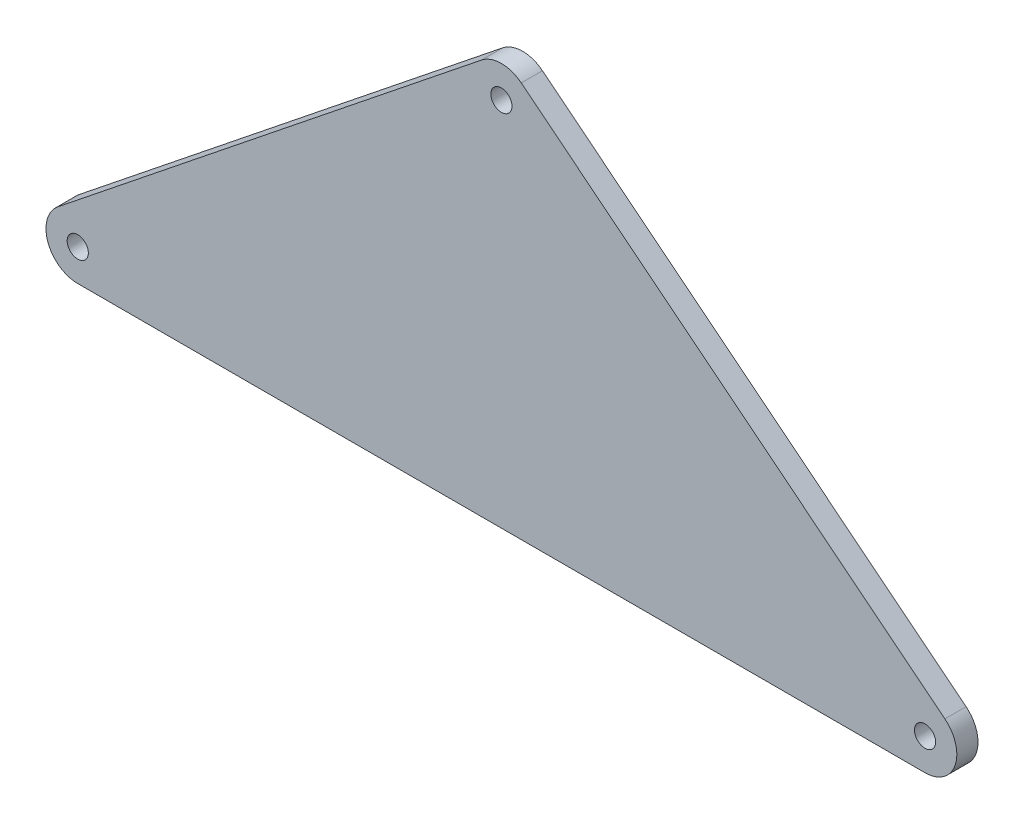
ISO-10303-21;
HEADER;
FILE_DESCRIPTION(('STEP AP214'),'2;1');
FILE_NAME('part.step','',(''),(''),'','','');
FILE_SCHEMA(('AUTOMOTIVE_DESIGN { 1 0 10303 214 1 1 1 1 }'));
ENDSEC;
DATA;
#1=APPLICATION_CONTEXT('core data for automotive mechanical design processes');
#2=APPLICATION_PROTOCOL_DEFINITION('international standard','automotive_design',2000,#1);
#3=PRODUCT_CONTEXT('',#1,'mechanical');
#4=PRODUCT('Part','Part','',(#3));
#5=PRODUCT_RELATED_PRODUCT_CATEGORY('part','',(#4));
#6=PRODUCT_DEFINITION_FORMATION('','',#4);
#7=PRODUCT_DEFINITION_CONTEXT('part definition',#1,'design');
#8=PRODUCT_DEFINITION('design','',#6,#7);
#9=PRODUCT_DEFINITION_SHAPE('','',#8);
#10=(LENGTH_UNIT() NAMED_UNIT(*) SI_UNIT(.MILLI.,.METRE.));
#11=(NAMED_UNIT(*) PLANE_ANGLE_UNIT() SI_UNIT($,.RADIAN.));
#12=(NAMED_UNIT(*) SI_UNIT($,.STERADIAN.) SOLID_ANGLE_UNIT());
#13=UNCERTAINTY_MEASURE_WITH_UNIT(LENGTH_MEASURE(1.E-05),#10,'distance_accuracy_value','');
#14=(GEOMETRIC_REPRESENTATION_CONTEXT(3) GLOBAL_UNCERTAINTY_ASSIGNED_CONTEXT((#13)) GLOBAL_UNIT_ASSIGNED_CONTEXT((#10,
#11,#12)) REPRESENTATION_CONTEXT('',''));
#15=CARTESIAN_POINT('',(0.,0.,0.));
#16=DIRECTION('',(0.,0.,1.));
#17=DIRECTION('',(1.,0.,0.));
#18=AXIS2_PLACEMENT_3D('',#15,#16,#17);
#19=CARTESIAN_POINT('',(-7.21644966006352E-13,-4.76249999999923,3.175));
#20=DIRECTION('',(0.,1.00000000000001,0.));
#21=DIRECTION('',(-1.00000000000001,0.,0.));
#22=AXIS2_PLACEMENT_3D('',#19,#20,#21);
#23=PLANE('',#22);
#24=DIRECTION('',(1.00000000000001,0.,0.));
#25=VECTOR('',#24,1.);
#26=CARTESIAN_POINT('',(-7.21644966006352E-13,-4.76249999999923,0.));
#27=LINE('',#26,#25);
#28=CARTESIAN_POINT('',(-7.21644966006352E-13,-4.76249999999923,0.));
#29=VERTEX_POINT('',#28);
#30=CARTESIAN_POINT('',(127.,-4.76249999999917,0.));
#31=VERTEX_POINT('',#30);
#32=EDGE_CURVE('E129',#29,#31,#27,.T.);
#33=ORIENTED_EDGE('',*,*,#32,.T.);
#34=DIRECTION('',(0.,0.,-0.999999999999993));
#35=VECTOR('',#34,1.);
#36=CARTESIAN_POINT('',(127.,-4.76249999999917,3.175));
#37=LINE('',#36,#35);
#38=CARTESIAN_POINT('',(127.,-4.76249999999917,3.175));
#39=VERTEX_POINT('',#38);
#40=EDGE_CURVE('E11',#39,#31,#37,.T.);
#41=ORIENTED_EDGE('',*,*,#40,.F.);
#42=DIRECTION('',(1.00000000000001,0.,0.));
#43=VECTOR('',#42,1.);
#44=CARTESIAN_POINT('',(-7.21644966006352E-13,-4.76249999999923,3.175));
#45=LINE('',#44,#43);
#46=CARTESIAN_POINT('',(-7.21644966006352E-13,-4.76249999999923,3.175));
#47=VERTEX_POINT('',#46);
#48=EDGE_CURVE('E150',#47,#39,#45,.T.);
#49=ORIENTED_EDGE('',*,*,#48,.F.);
#50=DIRECTION('',(0.,0.,-0.999999999999993));
#51=VECTOR('',#50,1.);
#52=CARTESIAN_POINT('',(-7.21644966006352E-13,-4.76249999999923,3.175));
#53=LINE('',#52,#51);
#54=EDGE_CURVE('E128',#47,#29,#53,.T.);
#55=ORIENTED_EDGE('',*,*,#54,.T.);
#56=EDGE_LOOP('',(#33,#41,#49,#55));
#57=FACE_BOUND('',#56,.T.);
#58=ADVANCED_FACE('F36',(#57),#23,.F.);
#59=CARTESIAN_POINT('',(127.,9.15933995315754E-13,3.175));
#60=DIRECTION('',(0.,0.,-0.999999999999993));
#61=DIRECTION('',(-1.00000000000001,0.,0.));
#62=AXIS2_PLACEMENT_3D('',#59,#60,#61);
#63=CYLINDRICAL_SURFACE('',#62,4.76250000000001);
#64=CARTESIAN_POINT('',(127.,9.15933995315754E-13,0.));
#65=DIRECTION('',(0.,0.,0.999999999999993));
#66=DIRECTION('',(1.00000000000001,0.,0.));
#67=AXIS2_PLACEMENT_3D('',#64,#65,#66);
#68=CIRCLE('',#67,4.76250000000001);
#69=CARTESIAN_POINT('',(129.975110163979,3.71888770497322,0.));
#70=VERTEX_POINT('',#69);
#71=EDGE_CURVE('E132',#31,#70,#68,.T.);
#72=ORIENTED_EDGE('',*,*,#71,.T.);
#73=DIRECTION('',(0.,0.,-0.999999999999993));
#74=VECTOR('',#73,1.);
#75=CARTESIAN_POINT('',(129.975110163979,3.71888770497322,3.175));
#76=LINE('',#75,#74);
#77=CARTESIAN_POINT('',(129.975110163979,3.71888770497322,3.175));
#78=VERTEX_POINT('',#77);
#79=EDGE_CURVE('E44',#78,#70,#76,.T.);
#80=ORIENTED_EDGE('',*,*,#79,.F.);
#81=CARTESIAN_POINT('',(127.,9.15933995315754E-13,3.175));
#82=DIRECTION('',(0.,0.,0.999999999999993));
#83=DIRECTION('',(1.00000000000001,0.,0.));
#84=AXIS2_PLACEMENT_3D('',#81,#82,#83);
#85=CIRCLE('',#84,4.76250000000001);
#86=EDGE_CURVE('E89',#39,#78,#85,.T.);
#87=ORIENTED_EDGE('',*,*,#86,.F.);
#88=ORIENTED_EDGE('',*,*,#40,.T.);
#89=EDGE_LOOP('',(#72,#80,#87,#88));
#90=FACE_BOUND('',#89,.T.);
#91=ADVANCED_FACE('F156',(#90),#63,.T.);
#92=CARTESIAN_POINT('',(52.5360857737335,65.6701072171687,3.175));
#93=DIRECTION('',(0.624695047554427,0.780868809443034,0.));
#94=DIRECTION('',(-0.780868809443035,0.624695047554427,0.));
#95=AXIS2_PLACEMENT_3D('',#92,#93,#94);
#96=PLANE('',#95);
#97=DIRECTION('',(0.780868809443035,-0.624695047554427,0.));
#98=VECTOR('',#97,1.);
#99=CARTESIAN_POINT('',(52.5360857737335,65.6701072171687,0.));
#100=LINE('',#99,#98);
#101=CARTESIAN_POINT('',(66.4751101639774,54.5188877049733,0.));
#102=VERTEX_POINT('',#101);
#103=EDGE_CURVE('E135',#102,#70,#100,.T.);
#104=ORIENTED_EDGE('',*,*,#103,.F.);
#105=DIRECTION('',(0.,0.,-0.999999999999993));
#106=VECTOR('',#105,1.);
#107=CARTESIAN_POINT('',(66.4751101639774,54.5188877049733,3.175));
#108=LINE('',#107,#106);
#109=CARTESIAN_POINT('',(66.4751101639774,54.5188877049733,3.175));
#110=VERTEX_POINT('',#109);
#111=EDGE_CURVE('E111',#110,#102,#108,.T.);
#112=ORIENTED_EDGE('',*,*,#111,.F.);
#113=DIRECTION('',(0.780868809443035,-0.624695047554427,0.));
#114=VECTOR('',#113,1.);
#115=CARTESIAN_POINT('',(52.5360857737335,65.6701072171687,3.175));
#116=LINE('',#115,#114);
#117=EDGE_CURVE('E104',#110,#78,#116,.T.);
#118=ORIENTED_EDGE('',*,*,#117,.T.);
#119=ORIENTED_EDGE('',*,*,#79,.T.);
#120=EDGE_LOOP('',(#104,#112,#118,#119));
#121=FACE_BOUND('',#120,.T.);
#122=ADVANCED_FACE('F155',(#121),#96,.T.);
#123=CARTESIAN_POINT('',(63.4999999999999,50.8000000000009,3.175));
#124=DIRECTION('',(0.,0.,-0.999999999999993));
#125=DIRECTION('',(-1.00000000000001,0.,0.));
#126=AXIS2_PLACEMENT_3D('',#123,#124,#125);
#127=CYLINDRICAL_SURFACE('',#126,4.7625);
#128=CARTESIAN_POINT('',(63.4999999999999,50.8000000000009,0.));
#129=DIRECTION('',(0.,0.,0.999999999999993));
#130=DIRECTION('',(1.00000000000001,0.,0.));
#131=AXIS2_PLACEMENT_3D('',#128,#129,#130);
#132=CIRCLE('',#131,4.7625);
#133=CARTESIAN_POINT('',(60.524889836022,54.5188877049733,0.));
#134=VERTEX_POINT('',#133);
#135=EDGE_CURVE('E110',#102,#134,#132,.T.);
#136=ORIENTED_EDGE('',*,*,#135,.T.);
#137=DIRECTION('',(0.,0.,-0.999999999999993));
#138=VECTOR('',#137,1.);
#139=CARTESIAN_POINT('',(60.524889836022,54.5188877049733,3.175));
#140=LINE('',#139,#138);
#141=CARTESIAN_POINT('',(60.524889836022,54.5188877049733,3.175));
#142=VERTEX_POINT('',#141);
#143=EDGE_CURVE('E107',#142,#134,#140,.T.);
#144=ORIENTED_EDGE('',*,*,#143,.F.);
#145=CARTESIAN_POINT('',(63.4999999999999,50.8000000000009,3.175));
#146=DIRECTION('',(0.,0.,0.999999999999993));
#147=DIRECTION('',(1.00000000000001,0.,0.));
#148=AXIS2_PLACEMENT_3D('',#145,#146,#147);
#149=CIRCLE('',#148,4.7625);
#150=EDGE_CURVE('E97',#110,#142,#149,.T.);
#151=ORIENTED_EDGE('',*,*,#150,.F.);
#152=ORIENTED_EDGE('',*,*,#111,.T.);
#153=EDGE_LOOP('',(#136,#144,#151,#152));
#154=FACE_BOUND('',#153,.T.);
#155=ADVANCED_FACE('F108',(#154),#127,.T.);
#156=CARTESIAN_POINT('',(-2.97511016397858,3.71888770497356,3.175));
#157=DIRECTION('',(0.624695047554428,-0.780868809443035,0.));
#158=DIRECTION('',(0.780868809443035,0.624695047554428,0.));
#159=AXIS2_PLACEMENT_3D('',#156,#157,#158);
#160=PLANE('',#159);
#161=DIRECTION('',(-0.780868809443035,-0.624695047554428,0.));
#162=VECTOR('',#161,1.);
#163=CARTESIAN_POINT('',(-2.97511016397858,3.71888770497356,0.));
#164=LINE('',#163,#162);
#165=CARTESIAN_POINT('',(-2.97511016397861,3.71888770497358,0.));
#166=VERTEX_POINT('',#165);
#167=EDGE_CURVE('E75',#134,#166,#164,.T.);
#168=ORIENTED_EDGE('',*,*,#167,.T.);
#169=DIRECTION('',(0.,0.,-0.999999999999993));
#170=VECTOR('',#169,1.);
#171=CARTESIAN_POINT('',(-2.97511016397861,3.71888770497358,3.175));
#172=LINE('',#171,#170);
#173=CARTESIAN_POINT('',(-2.97511016397861,3.71888770497358,3.175));
#174=VERTEX_POINT('',#173);
#175=EDGE_CURVE('E112',#174,#166,#172,.T.);
#176=ORIENTED_EDGE('',*,*,#175,.F.);
#177=DIRECTION('',(-0.780868809443035,-0.624695047554428,0.));
#178=VECTOR('',#177,1.);
#179=CARTESIAN_POINT('',(-2.97511016397858,3.71888770497356,3.175));
#180=LINE('',#179,#178);
#181=EDGE_CURVE('E102',#142,#174,#180,.T.);
#182=ORIENTED_EDGE('',*,*,#181,.F.);
#183=ORIENTED_EDGE('',*,*,#143,.T.);
#184=EDGE_LOOP('',(#168,#176,#182,#183));
#185=FACE_BOUND('',#184,.T.);
#186=ADVANCED_FACE('F114',(#185),#160,.F.);
#187=CARTESIAN_POINT('',(63.4999999999999,50.8000000000009,3.175));
#188=DIRECTION('',(0.,0.,-0.999999999999993));
#189=DIRECTION('',(-1.00000000000001,0.,0.));
#190=AXIS2_PLACEMENT_3D('',#187,#188,#189);
#191=CYLINDRICAL_SURFACE('',#190,1.5875);
#192=CARTESIAN_POINT('',(63.4999999999999,50.8000000000009,3.175));
#193=DIRECTION('',(0.,0.,0.999999999999993));
#194=DIRECTION('',(1.00000000000001,0.,0.));
#195=AXIS2_PLACEMENT_3D('',#192,#193,#194);
#196=CIRCLE('',#195,1.5875);
#197=CARTESIAN_POINT('',(61.9124999999999,50.8000000000009,3.175));
#198=VERTEX_POINT('',#197);
#199=EDGE_CURVE('E122',#198,#198,#196,.T.);
#200=CARTESIAN_POINT('',(63.4999999999999,50.8000000000009,0.));
#201=DIRECTION('',(0.,0.,0.999999999999993));
#202=DIRECTION('',(1.00000000000001,0.,0.));
#203=AXIS2_PLACEMENT_3D('',#200,#201,#202);
#204=CIRCLE('',#203,1.5875);
#205=CARTESIAN_POINT('',(61.9124999999999,50.8000000000009,0.));
#206=VERTEX_POINT('',#205);
#207=EDGE_CURVE('E144',#206,#206,#204,.T.);
#208=CARTESIAN_POINT('',(61.9124999999999,50.8000000000009,3.175));
#209=CARTESIAN_POINT('',(61.9124999999999,50.8000000000009,3.14192708333333));
#210=CARTESIAN_POINT('',(61.9124999999999,50.8000000000009,3.10885416666666));
#211=CARTESIAN_POINT('',(61.9124999999999,50.8000000000009,3.04270833333333));
#212=CARTESIAN_POINT('',(61.9124999999999,50.8000000000009,3.00963541666666));
#213=CARTESIAN_POINT('',(61.9124999999999,50.8000000000009,2.94348958333333));
#214=CARTESIAN_POINT('',(61.9124999999999,50.8000000000009,2.91041666666666));
#215=CARTESIAN_POINT('',(61.9124999999999,50.8000000000009,2.84427083333333));
#216=CARTESIAN_POINT('',(61.9124999999999,50.8000000000009,2.81119791666666));
#217=CARTESIAN_POINT('',(61.9124999999999,50.8000000000009,2.74505208333333));
#218=CARTESIAN_POINT('',(61.9124999999999,50.8000000000009,2.71197916666666));
#219=CARTESIAN_POINT('',(61.9124999999999,50.8000000000009,2.64583333333333));
#220=CARTESIAN_POINT('',(61.9124999999999,50.8000000000009,2.61276041666666));
#221=CARTESIAN_POINT('',(61.9124999999999,50.8000000000009,2.54661458333333));
#222=CARTESIAN_POINT('',(61.9124999999999,50.8000000000009,2.51354166666667));
#223=CARTESIAN_POINT('',(61.9124999999999,50.8000000000009,2.44739583333333));
#224=CARTESIAN_POINT('',(61.9124999999999,50.8000000000009,2.41432291666667));
#225=CARTESIAN_POINT('',(61.9124999999999,50.8000000000009,2.34817708333333));
#226=CARTESIAN_POINT('',(61.9124999999999,50.8000000000009,2.31510416666666));
#227=CARTESIAN_POINT('',(61.9124999999999,50.8000000000009,2.24895833333333));
#228=CARTESIAN_POINT('',(61.9124999999999,50.8000000000009,2.21588541666666));
#229=CARTESIAN_POINT('',(61.9124999999999,50.8000000000009,2.14973958333333));
#230=CARTESIAN_POINT('',(61.9124999999999,50.8000000000009,2.11666666666666));
#231=CARTESIAN_POINT('',(61.9124999999999,50.8000000000009,2.05052083333333));
#232=CARTESIAN_POINT('',(61.9124999999999,50.8000000000009,2.01744791666667));
#233=CARTESIAN_POINT('',(61.9124999999999,50.8000000000009,1.95130208333333));
#234=CARTESIAN_POINT('',(61.9124999999999,50.8000000000009,1.91822916666667));
#235=CARTESIAN_POINT('',(61.9124999999999,50.8000000000009,1.85208333333333));
#236=CARTESIAN_POINT('',(61.9124999999999,50.8000000000009,1.81901041666667));
#237=CARTESIAN_POINT('',(61.9124999999999,50.8000000000009,1.75286458333333));
#238=CARTESIAN_POINT('',(61.9124999999999,50.8000000000009,1.71979166666667));
#239=CARTESIAN_POINT('',(61.9124999999999,50.8000000000009,1.65364583333333));
#240=CARTESIAN_POINT('',(61.9124999999999,50.8000000000009,1.62057291666667));
#241=CARTESIAN_POINT('',(61.9124999999999,50.8000000000009,1.55442708333333));
#242=CARTESIAN_POINT('',(61.9124999999999,50.8000000000009,1.52135416666667));
#243=CARTESIAN_POINT('',(61.9124999999999,50.8000000000009,1.45520833333333));
#244=CARTESIAN_POINT('',(61.9124999999999,50.8000000000009,1.42213541666667));
#245=CARTESIAN_POINT('',(61.9124999999999,50.8000000000009,1.35598958333333));
#246=CARTESIAN_POINT('',(61.9124999999999,50.8000000000009,1.32291666666667));
#247=CARTESIAN_POINT('',(61.9124999999999,50.8000000000009,1.25677083333333));
#248=CARTESIAN_POINT('',(61.9124999999999,50.8000000000009,1.22369791666667));
#249=CARTESIAN_POINT('',(61.9124999999999,50.8000000000009,1.15755208333333));
#250=CARTESIAN_POINT('',(61.9124999999999,50.8000000000009,1.12447916666667));
#251=CARTESIAN_POINT('',(61.9124999999999,50.8000000000009,1.05833333333333));
#252=CARTESIAN_POINT('',(61.9124999999999,50.8000000000009,1.02526041666667));
#253=CARTESIAN_POINT('',(61.9124999999999,50.8000000000009,0.959114583333333));
#254=CARTESIAN_POINT('',(61.9124999999999,50.8000000000009,0.926041666666666));
#255=CARTESIAN_POINT('',(61.9124999999999,50.8000000000009,0.859895833333333));
#256=CARTESIAN_POINT('',(61.9124999999999,50.8000000000009,0.826822916666666));
#257=CARTESIAN_POINT('',(61.9124999999999,50.8000000000009,0.760677083333333));
#258=CARTESIAN_POINT('',(61.9124999999999,50.8000000000009,0.727604166666666));
#259=CARTESIAN_POINT('',(61.9124999999999,50.8000000000009,0.661458333333333));
#260=CARTESIAN_POINT('',(61.9124999999999,50.8000000000009,0.628385416666666));
#261=CARTESIAN_POINT('',(61.9124999999999,50.8000000000009,0.562239583333333));
#262=CARTESIAN_POINT('',(61.9124999999999,50.8000000000009,0.529166666666666));
#263=CARTESIAN_POINT('',(61.9124999999999,50.8000000000009,0.463020833333333));
#264=CARTESIAN_POINT('',(61.9124999999999,50.8000000000009,0.429947916666666));
#265=CARTESIAN_POINT('',(61.9124999999999,50.8000000000009,0.363802083333333));
#266=CARTESIAN_POINT('',(61.9124999999999,50.8000000000009,0.330729166666666));
#267=CARTESIAN_POINT('',(61.9124999999999,50.8000000000009,0.264583333333333));
#268=CARTESIAN_POINT('',(61.9124999999999,50.8000000000009,0.231510416666666));
#269=CARTESIAN_POINT('',(61.9124999999999,50.8000000000009,0.165364583333333));
#270=CARTESIAN_POINT('',(61.9124999999999,50.8000000000009,0.132291666666666));
#271=CARTESIAN_POINT('',(61.9124999999999,50.8000000000009,0.0661458333333333));
#272=CARTESIAN_POINT('',(61.9124999999999,50.8000000000009,0.0330729166666666));
#273=CARTESIAN_POINT('',(61.9124999999999,50.8000000000009,0.));
#274=B_SPLINE_CURVE_WITH_KNOTS('',3,(#208,#209,#210,#211,#212,#213,#214,#215,#216,#217,#218,
#219,#220,#221,#222,#223,#224,#225,#226,#227,#228,#229,#230,#231,#232,#233,#234,#235,#236,#237,
#238,#239,#240,#241,#242,#243,#244,#245,#246,#247,#248,#249,#250,#251,#252,#253,#254,#255,#256,
#257,#258,#259,#260,#261,#262,#263,#264,#265,#266,#267,#268,#269,#270,#271,#272,#273),
.UNSPECIFIED.,.F.,.F.,(4,2,2,2,2,2,2,2,2,2,2,2,2,2,2,2,2,2,2,2,2,2,2,2,2,2,2,2,2,2,2,2,4),(0.,
0.0992187499999995,0.1984375,0.297656249999999,0.396875,0.496093749999999,0.595312499999999,
0.694531249999999,0.793749999999999,0.892968749999999,0.992187499999999,1.09140625,1.190625,
1.28984375,1.3890625,1.48828125,1.5875,1.68671875,1.7859375,1.88515625,1.984375,2.08359375,
2.1828125,2.28203125,2.38125,2.48046875,2.5796875,2.67890625,2.778125,2.87734375,2.9765625,
3.07578125,3.175),.UNSPECIFIED.);
#275=EDGE_CURVE('BSEAM175',#198,#206,#274,.T.);
#276=ORIENTED_EDGE('',*,*,#199,.T.);
#277=ORIENTED_EDGE('',*,*,#207,.F.);
#278=ORIENTED_EDGE('',*,*,#275,.T.);
#279=ORIENTED_EDGE('',*,*,#275,.F.);
#280=EDGE_LOOP('',(#276,#278,#277,#279));
#281=FACE_BOUND('',#280,.T.);
#282=ADVANCED_FACE('F175',(#281),#191,.F.);
#283=CARTESIAN_POINT('',(0.,0.,3.175));
#284=DIRECTION('',(0.,0.,-0.999999999999993));
#285=DIRECTION('',(-1.00000000000001,0.,0.));
#286=AXIS2_PLACEMENT_3D('',#283,#284,#285);
#287=CYLINDRICAL_SURFACE('',#286,1.5875);
#288=CARTESIAN_POINT('',(0.,0.,3.175));
#289=DIRECTION('',(0.,0.,0.999999999999993));
#290=DIRECTION('',(1.00000000000001,0.,0.));
#291=AXIS2_PLACEMENT_3D('',#288,#289,#290);
#292=CIRCLE('',#291,1.5875);
#293=CARTESIAN_POINT('',(-1.58750000000001,0.,3.175));
#294=VERTEX_POINT('',#293);
#295=EDGE_CURVE('E116',#294,#294,#292,.T.);
#296=CARTESIAN_POINT('',(0.,0.,0.));
#297=DIRECTION('',(0.,0.,0.999999999999993));
#298=DIRECTION('',(1.00000000000001,0.,0.));
#299=AXIS2_PLACEMENT_3D('',#296,#297,#298);
#300=CIRCLE('',#299,1.5875);
#301=CARTESIAN_POINT('',(-1.58750000000001,0.,0.));
#302=VERTEX_POINT('',#301);
#303=EDGE_CURVE('E141',#302,#302,#300,.T.);
#304=CARTESIAN_POINT('',(-1.58750000000001,0.,3.175));
#305=CARTESIAN_POINT('',(-1.58750000000001,0.,3.14192708333333));
#306=CARTESIAN_POINT('',(-1.58750000000001,0.,3.10885416666666));
#307=CARTESIAN_POINT('',(-1.58750000000001,0.,3.04270833333333));
#308=CARTESIAN_POINT('',(-1.58750000000001,0.,3.00963541666666));
#309=CARTESIAN_POINT('',(-1.58750000000001,0.,2.94348958333333));
#310=CARTESIAN_POINT('',(-1.58750000000001,0.,2.91041666666666));
#311=CARTESIAN_POINT('',(-1.58750000000001,0.,2.84427083333333));
#312=CARTESIAN_POINT('',(-1.58750000000001,0.,2.81119791666666));
#313=CARTESIAN_POINT('',(-1.58750000000001,0.,2.74505208333333));
#314=CARTESIAN_POINT('',(-1.58750000000001,0.,2.71197916666666));
#315=CARTESIAN_POINT('',(-1.58750000000001,0.,2.64583333333333));
#316=CARTESIAN_POINT('',(-1.58750000000001,0.,2.61276041666666));
#317=CARTESIAN_POINT('',(-1.58750000000001,0.,2.54661458333333));
#318=CARTESIAN_POINT('',(-1.58750000000001,0.,2.51354166666667));
#319=CARTESIAN_POINT('',(-1.58750000000001,0.,2.44739583333333));
#320=CARTESIAN_POINT('',(-1.58750000000001,0.,2.41432291666667));
#321=CARTESIAN_POINT('',(-1.58750000000001,0.,2.34817708333333));
#322=CARTESIAN_POINT('',(-1.58750000000001,0.,2.31510416666666));
#323=CARTESIAN_POINT('',(-1.58750000000001,0.,2.24895833333333));
#324=CARTESIAN_POINT('',(-1.58750000000001,0.,2.21588541666666));
#325=CARTESIAN_POINT('',(-1.58750000000001,0.,2.14973958333333));
#326=CARTESIAN_POINT('',(-1.58750000000001,0.,2.11666666666666));
#327=CARTESIAN_POINT('',(-1.58750000000001,0.,2.05052083333333));
#328=CARTESIAN_POINT('',(-1.58750000000001,0.,2.01744791666667));
#329=CARTESIAN_POINT('',(-1.58750000000001,0.,1.95130208333333));
#330=CARTESIAN_POINT('',(-1.58750000000001,0.,1.91822916666667));
#331=CARTESIAN_POINT('',(-1.58750000000001,0.,1.85208333333333));
#332=CARTESIAN_POINT('',(-1.58750000000001,0.,1.81901041666667));
#333=CARTESIAN_POINT('',(-1.58750000000001,0.,1.75286458333333));
#334=CARTESIAN_POINT('',(-1.58750000000001,0.,1.71979166666667));
#335=CARTESIAN_POINT('',(-1.58750000000001,0.,1.65364583333333));
#336=CARTESIAN_POINT('',(-1.58750000000001,0.,1.62057291666667));
#337=CARTESIAN_POINT('',(-1.58750000000001,0.,1.55442708333333));
#338=CARTESIAN_POINT('',(-1.58750000000001,0.,1.52135416666667));
#339=CARTESIAN_POINT('',(-1.58750000000001,0.,1.45520833333333));
#340=CARTESIAN_POINT('',(-1.58750000000001,0.,1.42213541666667));
#341=CARTESIAN_POINT('',(-1.58750000000001,0.,1.35598958333333));
#342=CARTESIAN_POINT('',(-1.58750000000001,0.,1.32291666666667));
#343=CARTESIAN_POINT('',(-1.58750000000001,0.,1.25677083333333));
#344=CARTESIAN_POINT('',(-1.58750000000001,0.,1.22369791666667));
#345=CARTESIAN_POINT('',(-1.58750000000001,0.,1.15755208333333));
#346=CARTESIAN_POINT('',(-1.58750000000001,0.,1.12447916666667));
#347=CARTESIAN_POINT('',(-1.58750000000001,0.,1.05833333333333));
#348=CARTESIAN_POINT('',(-1.58750000000001,0.,1.02526041666667));
#349=CARTESIAN_POINT('',(-1.58750000000001,0.,0.959114583333333));
#350=CARTESIAN_POINT('',(-1.58750000000001,0.,0.926041666666666));
#351=CARTESIAN_POINT('',(-1.58750000000001,0.,0.859895833333333));
#352=CARTESIAN_POINT('',(-1.58750000000001,0.,0.826822916666666));
#353=CARTESIAN_POINT('',(-1.58750000000001,0.,0.760677083333333));
#354=CARTESIAN_POINT('',(-1.58750000000001,0.,0.727604166666666));
#355=CARTESIAN_POINT('',(-1.58750000000001,0.,0.661458333333333));
#356=CARTESIAN_POINT('',(-1.58750000000001,0.,0.628385416666666));
#357=CARTESIAN_POINT('',(-1.58750000000001,0.,0.562239583333333));
#358=CARTESIAN_POINT('',(-1.58750000000001,0.,0.529166666666666));
#359=CARTESIAN_POINT('',(-1.58750000000001,0.,0.463020833333333));
#360=CARTESIAN_POINT('',(-1.58750000000001,0.,0.429947916666666));
#361=CARTESIAN_POINT('',(-1.58750000000001,0.,0.363802083333333));
#362=CARTESIAN_POINT('',(-1.58750000000001,0.,0.330729166666666));
#363=CARTESIAN_POINT('',(-1.58750000000001,0.,0.264583333333333));
#364=CARTESIAN_POINT('',(-1.58750000000001,0.,0.231510416666666));
#365=CARTESIAN_POINT('',(-1.58750000000001,0.,0.165364583333333));
#366=CARTESIAN_POINT('',(-1.58750000000001,0.,0.132291666666666));
#367=CARTESIAN_POINT('',(-1.58750000000001,0.,0.0661458333333333));
#368=CARTESIAN_POINT('',(-1.58750000000001,0.,0.0330729166666666));
#369=CARTESIAN_POINT('',(-1.58750000000001,0.,0.));
#370=B_SPLINE_CURVE_WITH_KNOTS('',3,(#304,#305,#306,#307,#308,#309,#310,#311,#312,#313,#314,
#315,#316,#317,#318,#319,#320,#321,#322,#323,#324,#325,#326,#327,#328,#329,#330,#331,#332,#333,
#334,#335,#336,#337,#338,#339,#340,#341,#342,#343,#344,#345,#346,#347,#348,#349,#350,#351,#352,
#353,#354,#355,#356,#357,#358,#359,#360,#361,#362,#363,#364,#365,#366,#367,#368,#369),
.UNSPECIFIED.,.F.,.F.,(4,2,2,2,2,2,2,2,2,2,2,2,2,2,2,2,2,2,2,2,2,2,2,2,2,2,2,2,2,2,2,2,4),(0.,
0.0992187499999995,0.1984375,0.297656249999999,0.396875,0.496093749999999,0.595312499999999,
0.694531249999999,0.793749999999999,0.892968749999999,0.992187499999999,1.09140625,1.190625,
1.28984375,1.3890625,1.48828125,1.5875,1.68671875,1.7859375,1.88515625,1.984375,2.08359375,
2.1828125,2.28203125,2.38125,2.48046875,2.5796875,2.67890625,2.778125,2.87734375,2.9765625,
3.07578125,3.175),.UNSPECIFIED.);
#371=EDGE_CURVE('BSEAM167',#294,#302,#370,.T.);
#372=ORIENTED_EDGE('',*,*,#295,.T.);
#373=ORIENTED_EDGE('',*,*,#303,.F.);
#374=ORIENTED_EDGE('',*,*,#371,.T.);
#375=ORIENTED_EDGE('',*,*,#371,.F.);
#376=EDGE_LOOP('',(#372,#374,#373,#375));
#377=FACE_BOUND('',#376,.T.);
#378=ADVANCED_FACE('F167',(#377),#287,.F.);
#379=CARTESIAN_POINT('',(0.,0.,3.175));
#380=DIRECTION('',(0.,0.,-0.999999999999993));
#381=DIRECTION('',(-1.00000000000001,0.,0.));
#382=AXIS2_PLACEMENT_3D('',#379,#380,#381);
#383=CYLINDRICAL_SURFACE('',#382,4.7625);
#384=CARTESIAN_POINT('',(0.,0.,0.));
#385=DIRECTION('',(0.,0.,0.999999999999993));
#386=DIRECTION('',(1.00000000000001,0.,0.));
#387=AXIS2_PLACEMENT_3D('',#384,#385,#386);
#388=CIRCLE('',#387,4.7625);
#389=EDGE_CURVE('E81',#166,#29,#388,.T.);
#390=ORIENTED_EDGE('',*,*,#389,.T.);
#391=ORIENTED_EDGE('',*,*,#54,.F.);
#392=CARTESIAN_POINT('',(0.,0.,3.175));
#393=DIRECTION('',(0.,0.,0.999999999999993));
#394=DIRECTION('',(1.00000000000001,0.,0.));
#395=AXIS2_PLACEMENT_3D('',#392,#393,#394);
#396=CIRCLE('',#395,4.7625);
#397=EDGE_CURVE('E52',#174,#47,#396,.T.);
#398=ORIENTED_EDGE('',*,*,#397,.F.);
#399=ORIENTED_EDGE('',*,*,#175,.T.);
#400=EDGE_LOOP('',(#390,#391,#398,#399));
#401=FACE_BOUND('',#400,.T.);
#402=ADVANCED_FACE('F164',(#401),#383,.T.);
#403=CARTESIAN_POINT('',(127.,9.15933995315754E-13,3.175));
#404=DIRECTION('',(0.,0.,-0.999999999999993));
#405=DIRECTION('',(-1.00000000000001,0.,0.));
#406=AXIS2_PLACEMENT_3D('',#403,#404,#405);
#407=CYLINDRICAL_SURFACE('',#406,1.58749999999999);
#408=CARTESIAN_POINT('',(127.,9.15933995315754E-13,3.175));
#409=DIRECTION('',(0.,0.,0.999999999999993));
#410=DIRECTION('',(1.00000000000001,0.,0.));
#411=AXIS2_PLACEMENT_3D('',#408,#409,#410);
#412=CIRCLE('',#411,1.58749999999999);
#413=CARTESIAN_POINT('',(125.4125,9.15757747410595E-13,3.175));
#414=VERTEX_POINT('',#413);
#415=EDGE_CURVE('E125',#414,#414,#412,.T.);
#416=CARTESIAN_POINT('',(127.,9.15933995315754E-13,0.));
#417=DIRECTION('',(0.,0.,0.999999999999993));
#418=DIRECTION('',(1.00000000000001,0.,0.));
#419=AXIS2_PLACEMENT_3D('',#416,#417,#418);
#420=CIRCLE('',#419,1.58749999999999);
#421=CARTESIAN_POINT('',(125.4125,9.15757764861431E-13,0.));
#422=VERTEX_POINT('',#421);
#423=EDGE_CURVE('E147',#422,#422,#420,.T.);
#424=CARTESIAN_POINT('',(125.4125,9.15757747410595E-13,3.175));
#425=CARTESIAN_POINT('',(125.4125,9.15757747592374E-13,3.14192708333333));
#426=CARTESIAN_POINT('',(125.4125,9.15757747774154E-13,3.10885416666666));
#427=CARTESIAN_POINT('',(125.4125,9.15757748137713E-13,3.04270833333333));
#428=CARTESIAN_POINT('',(125.4125,9.15757748319493E-13,3.00963541666666));
#429=CARTESIAN_POINT('',(125.4125,9.15757748683052E-13,2.94348958333333));
#430=CARTESIAN_POINT('',(125.4125,9.15757748864831E-13,2.91041666666666));
#431=CARTESIAN_POINT('',(125.4125,9.1575774922839E-13,2.84427083333333));
#432=CARTESIAN_POINT('',(125.4125,9.1575774941017E-13,2.81119791666666));
#433=CARTESIAN_POINT('',(125.4125,9.15757749773729E-13,2.74505208333333));
#434=CARTESIAN_POINT('',(125.4125,9.15757749955509E-13,2.71197916666666));
#435=CARTESIAN_POINT('',(125.4125,9.15757750319068E-13,2.64583333333333));
#436=CARTESIAN_POINT('',(125.4125,9.15757750500847E-13,2.61276041666666));
#437=CARTESIAN_POINT('',(125.4125,9.15757750864406E-13,2.54661458333333));
#438=CARTESIAN_POINT('',(125.4125,9.15757751046186E-13,2.51354166666667));
#439=CARTESIAN_POINT('',(125.4125,9.15757751409745E-13,2.44739583333333));
#440=CARTESIAN_POINT('',(125.4125,9.15757751591524E-13,2.41432291666667));
#441=CARTESIAN_POINT('',(125.4125,9.15757751955084E-13,2.34817708333333));
#442=CARTESIAN_POINT('',(125.4125,9.15757752136863E-13,2.31510416666666));
#443=CARTESIAN_POINT('',(125.4125,9.15757752500422E-13,2.24895833333333));
#444=CARTESIAN_POINT('',(125.4125,9.15757752682202E-13,2.21588541666666));
#445=CARTESIAN_POINT('',(125.4125,9.15757753045761E-13,2.14973958333333));
#446=CARTESIAN_POINT('',(125.4125,9.1575775322754E-13,2.11666666666666));
#447=CARTESIAN_POINT('',(125.4125,9.15757753591099E-13,2.05052083333333));
#448=CARTESIAN_POINT('',(125.4125,9.15757753772879E-13,2.01744791666667));
#449=CARTESIAN_POINT('',(125.4125,9.15757754136438E-13,1.95130208333333));
#450=CARTESIAN_POINT('',(125.4125,9.15757754318217E-13,1.91822916666667));
#451=CARTESIAN_POINT('',(125.4125,9.15757754681777E-13,1.85208333333333));
#452=CARTESIAN_POINT('',(125.4125,9.15757754863556E-13,1.81901041666667));
#453=CARTESIAN_POINT('',(125.4125,9.15757755227115E-13,1.75286458333333));
#454=CARTESIAN_POINT('',(125.4125,9.15757755408895E-13,1.71979166666667));
#455=CARTESIAN_POINT('',(125.4125,9.15757755772454E-13,1.65364583333333));
#456=CARTESIAN_POINT('',(125.4125,9.15757755954233E-13,1.62057291666667));
#457=CARTESIAN_POINT('',(125.4125,9.15757756317793E-13,1.55442708333333));
#458=CARTESIAN_POINT('',(125.4125,9.15757756499572E-13,1.52135416666667));
#459=CARTESIAN_POINT('',(125.4125,9.15757756863131E-13,1.45520833333333));
#460=CARTESIAN_POINT('',(125.4125,9.15757757044911E-13,1.42213541666667));
#461=CARTESIAN_POINT('',(125.4125,9.1575775740847E-13,1.35598958333333));
#462=CARTESIAN_POINT('',(125.4125,9.15757757590249E-13,1.32291666666667));
#463=CARTESIAN_POINT('',(125.4125,9.15757757953808E-13,1.25677083333333));
#464=CARTESIAN_POINT('',(125.4125,9.15757758135588E-13,1.22369791666667));
#465=CARTESIAN_POINT('',(125.4125,9.15757758499147E-13,1.15755208333333));
#466=CARTESIAN_POINT('',(125.4125,9.15757758680927E-13,1.12447916666667));
#467=CARTESIAN_POINT('',(125.4125,9.15757759044486E-13,1.05833333333333));
#468=CARTESIAN_POINT('',(125.4125,9.15757759226265E-13,1.02526041666667));
#469=CARTESIAN_POINT('',(125.4125,9.15757759589824E-13,0.959114583333333));
#470=CARTESIAN_POINT('',(125.4125,9.15757759771604E-13,0.926041666666666));
#471=CARTESIAN_POINT('',(125.4125,9.15757760135163E-13,0.859895833333333));
#472=CARTESIAN_POINT('',(125.4125,9.15757760316942E-13,0.826822916666666));
#473=CARTESIAN_POINT('',(125.4125,9.15757760680502E-13,0.760677083333333));
#474=CARTESIAN_POINT('',(125.4125,9.15757760862281E-13,0.727604166666666));
#475=CARTESIAN_POINT('',(125.4125,9.1575776122584E-13,0.661458333333333));
#476=CARTESIAN_POINT('',(125.4125,9.15757761407619E-13,0.628385416666666));
#477=CARTESIAN_POINT('',(125.4125,9.15757761771179E-13,0.562239583333333));
#478=CARTESIAN_POINT('',(125.4125,9.15757761952958E-13,0.529166666666666));
#479=CARTESIAN_POINT('',(125.4125,9.15757762316517E-13,0.463020833333333));
#480=CARTESIAN_POINT('',(125.4125,9.15757762498297E-13,0.429947916666666));
#481=CARTESIAN_POINT('',(125.4125,9.15757762861856E-13,0.363802083333333));
#482=CARTESIAN_POINT('',(125.4125,9.15757763043635E-13,0.330729166666666));
#483=CARTESIAN_POINT('',(125.4125,9.15757763407194E-13,0.264583333333333));
#484=CARTESIAN_POINT('',(125.4125,9.15757763588974E-13,0.231510416666666));
#485=CARTESIAN_POINT('',(125.4125,9.15757763952533E-13,0.165364583333333));
#486=CARTESIAN_POINT('',(125.4125,9.15757764134313E-13,0.132291666666666));
#487=CARTESIAN_POINT('',(125.4125,9.15757764497872E-13,0.0661458333333333));
#488=CARTESIAN_POINT('',(125.4125,9.15757764679651E-13,0.0330729166666666));
#489=CARTESIAN_POINT('',(125.4125,9.15757764861431E-13,0.));
#490=B_SPLINE_CURVE_WITH_KNOTS('',3,(#424,#425,#426,#427,#428,#429,#430,#431,#432,#433,#434,
#435,#436,#437,#438,#439,#440,#441,#442,#443,#444,#445,#446,#447,#448,#449,#450,#451,#452,#453,
#454,#455,#456,#457,#458,#459,#460,#461,#462,#463,#464,#465,#466,#467,#468,#469,#470,#471,#472,
#473,#474,#475,#476,#477,#478,#479,#480,#481,#482,#483,#484,#485,#486,#487,#488,#489),
.UNSPECIFIED.,.F.,.F.,(4,2,2,2,2,2,2,2,2,2,2,2,2,2,2,2,2,2,2,2,2,2,2,2,2,2,2,2,2,2,2,2,4),(0.,
0.0992187499999995,0.1984375,0.297656249999999,0.396875,0.496093749999999,0.595312499999999,
0.694531249999999,0.793749999999999,0.892968749999999,0.992187499999999,1.09140625,1.190625,
1.28984375,1.3890625,1.48828125,1.5875,1.68671875,1.7859375,1.88515625,1.984375,2.08359375,
2.1828125,2.28203125,2.38125,2.48046875,2.5796875,2.67890625,2.778125,2.87734375,2.9765625,
3.07578125,3.175),.UNSPECIFIED.);
#491=EDGE_CURVE('BSEAM166',#414,#422,#490,.T.);
#492=ORIENTED_EDGE('',*,*,#415,.T.);
#493=ORIENTED_EDGE('',*,*,#423,.F.);
#494=ORIENTED_EDGE('',*,*,#491,.T.);
#495=ORIENTED_EDGE('',*,*,#491,.F.);
#496=EDGE_LOOP('',(#492,#494,#493,#495));
#497=FACE_BOUND('',#496,.T.);
#498=ADVANCED_FACE('F166',(#497),#407,.F.);
#499=CARTESIAN_POINT('',(0.,0.,3.175));
#500=DIRECTION('',(0.,0.,0.999999999999993));
#501=DIRECTION('',(1.00000000000001,0.,0.));
#502=AXIS2_PLACEMENT_3D('',#499,#500,#501);
#503=PLANE('',#502);
#504=ORIENTED_EDGE('',*,*,#48,.T.);
#505=ORIENTED_EDGE('',*,*,#86,.T.);
#506=ORIENTED_EDGE('',*,*,#117,.F.);
#507=ORIENTED_EDGE('',*,*,#150,.T.);
#508=ORIENTED_EDGE('',*,*,#181,.T.);
#509=ORIENTED_EDGE('',*,*,#397,.T.);
#510=EDGE_LOOP('',(#504,#505,#506,#507,#508,#509));
#511=FACE_BOUND('',#510,.T.);
#512=ORIENTED_EDGE('',*,*,#295,.F.);
#513=EDGE_LOOP('',(#512));
#514=FACE_BOUND('',#513,.T.);
#515=ORIENTED_EDGE('',*,*,#199,.F.);
#516=EDGE_LOOP('',(#515));
#517=FACE_BOUND('',#516,.T.);
#518=ORIENTED_EDGE('',*,*,#415,.F.);
#519=EDGE_LOOP('',(#518));
#520=FACE_BOUND('',#519,.T.);
#521=ADVANCED_FACE('F99',(#511,#514,#517,#520),#503,.T.);
#522=CARTESIAN_POINT('',(0.,0.,0.));
#523=DIRECTION('',(0.,0.,0.999999999999993));
#524=DIRECTION('',(1.00000000000001,0.,0.));
#525=AXIS2_PLACEMENT_3D('',#522,#523,#524);
#526=PLANE('',#525);
#527=ORIENTED_EDGE('',*,*,#32,.F.);
#528=ORIENTED_EDGE('',*,*,#389,.F.);
#529=ORIENTED_EDGE('',*,*,#167,.F.);
#530=ORIENTED_EDGE('',*,*,#135,.F.);
#531=ORIENTED_EDGE('',*,*,#103,.T.);
#532=ORIENTED_EDGE('',*,*,#71,.F.);
#533=EDGE_LOOP('',(#527,#528,#529,#530,#531,#532));
#534=FACE_BOUND('',#533,.T.);
#535=ORIENTED_EDGE('',*,*,#303,.T.);
#536=EDGE_LOOP('',(#535));
#537=FACE_BOUND('',#536,.T.);
#538=ORIENTED_EDGE('',*,*,#207,.T.);
#539=EDGE_LOOP('',(#538));
#540=FACE_BOUND('',#539,.T.);
#541=ORIENTED_EDGE('',*,*,#423,.T.);
#542=EDGE_LOOP('',(#541));
#543=FACE_BOUND('',#542,.T.);
#544=ADVANCED_FACE('F160',(#534,#537,#540,#543),#526,.F.);
#545=CLOSED_SHELL('',(#58,#91,#122,#155,#186,#282,#378,#402,#498,#521,#544));
#546=MANIFOLD_SOLID_BREP('B2',#545);
#547=ADVANCED_BREP_SHAPE_REPRESENTATION('',(#18,#546),#14);
#548=SHAPE_DEFINITION_REPRESENTATION(#9,#547);
ENDSEC;
END-ISO-10303-21;
